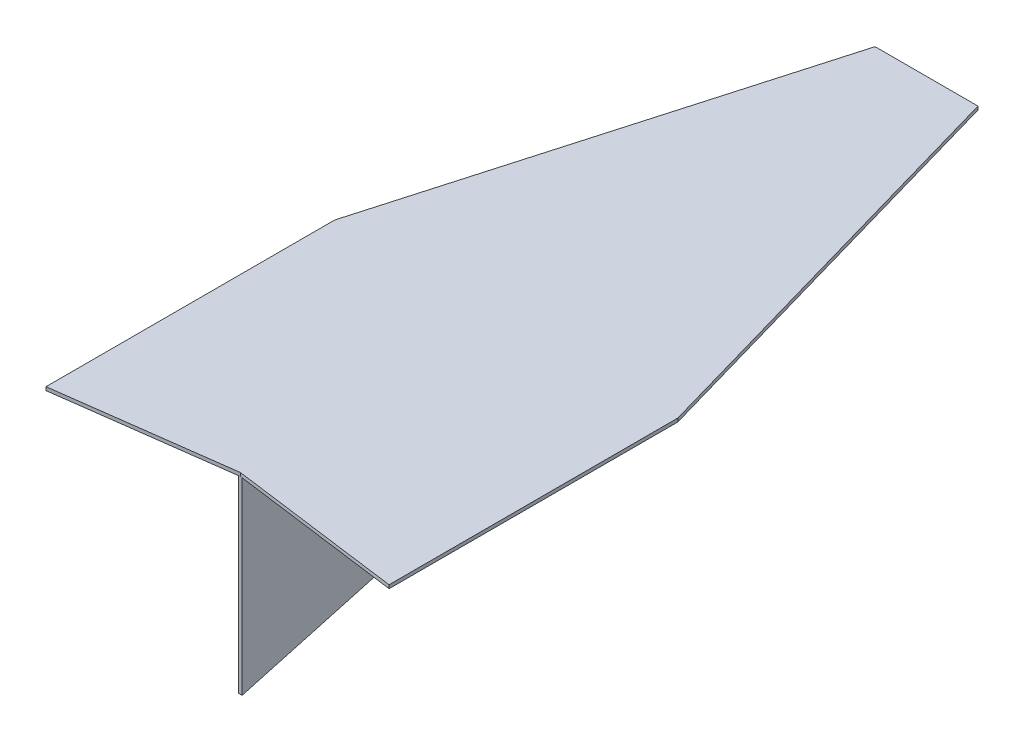
ISO-10303-21;
HEADER;
FILE_DESCRIPTION(('STEP AP214'),'2;1');
FILE_NAME('part.step','',(''),(''),'','','');
FILE_SCHEMA(('AUTOMOTIVE_DESIGN { 1 0 10303 214 1 1 1 1 }'));
ENDSEC;
DATA;
#1=APPLICATION_CONTEXT('core data for automotive mechanical design processes');
#2=APPLICATION_PROTOCOL_DEFINITION('international standard','automotive_design',2000,#1);
#3=PRODUCT_CONTEXT('',#1,'mechanical');
#4=PRODUCT('Part','Part','',(#3));
#5=PRODUCT_RELATED_PRODUCT_CATEGORY('part','',(#4));
#6=PRODUCT_DEFINITION_FORMATION('','',#4);
#7=PRODUCT_DEFINITION_CONTEXT('part definition',#1,'design');
#8=PRODUCT_DEFINITION('design','',#6,#7);
#9=PRODUCT_DEFINITION_SHAPE('','',#8);
#10=(LENGTH_UNIT() NAMED_UNIT(*) SI_UNIT(.MILLI.,.METRE.));
#11=(NAMED_UNIT(*) PLANE_ANGLE_UNIT() SI_UNIT($,.RADIAN.));
#12=(NAMED_UNIT(*) SI_UNIT($,.STERADIAN.) SOLID_ANGLE_UNIT());
#13=UNCERTAINTY_MEASURE_WITH_UNIT(LENGTH_MEASURE(1.E-05),#10,'distance_accuracy_value','');
#14=(GEOMETRIC_REPRESENTATION_CONTEXT(3) GLOBAL_UNCERTAINTY_ASSIGNED_CONTEXT((#13)) GLOBAL_UNIT_ASSIGNED_CONTEXT((#10,
#11,#12)) REPRESENTATION_CONTEXT('',''));
#15=CARTESIAN_POINT('',(0.,0.,0.));
#16=DIRECTION('',(0.,0.,1.));
#17=DIRECTION('',(1.,0.,0.));
#18=AXIS2_PLACEMENT_3D('',#15,#16,#17);
#19=CARTESIAN_POINT('',(0.,0.,0.));
#20=DIRECTION('',(0.,-1.,0.));
#21=DIRECTION('',(0.,0.,-1.));
#22=AXIS2_PLACEMENT_3D('',#19,#20,#21);
#23=PLANE('',#22);
#24=DIRECTION('',(0.,0.,1.));
#25=VECTOR('',#24,1.);
#26=CARTESIAN_POINT('',(-0.5,0.,0.));
#27=LINE('',#26,#25);
#28=CARTESIAN_POINT('',(-0.5,0.,-105.));
#29=VERTEX_POINT('',#28);
#30=CARTESIAN_POINT('',(-0.5,0.,95.));
#31=VERTEX_POINT('',#30);
#32=EDGE_CURVE('E201',#29,#31,#27,.T.);
#33=ORIENTED_EDGE('',*,*,#32,.T.);
#34=DIRECTION('',(1.,0.,0.));
#35=VECTOR('',#34,1.);
#36=CARTESIAN_POINT('',(-0.5,0.,95.));
#37=LINE('',#36,#35);
#38=CARTESIAN_POINT('',(1.50920942409982E-13,0.,95.));
#39=VERTEX_POINT('',#38);
#40=EDGE_CURVE('E50',#31,#39,#37,.T.);
#41=ORIENTED_EDGE('',*,*,#40,.T.);
#42=DIRECTION('',(0.991227900682635,0.,-0.132163720091018));
#43=VECTOR('',#42,1.);
#44=CARTESIAN_POINT('',(12.4454148471616,0.,93.3406113537118));
#45=LINE('',#44,#43);
#46=CARTESIAN_POINT('',(-50.,0.,101.666666666667));
#47=VERTEX_POINT('',#46);
#48=EDGE_CURVE('E193',#47,#39,#45,.T.);
#49=ORIENTED_EDGE('',*,*,#48,.F.);
#50=DIRECTION('',(0.,0.,1.));
#51=VECTOR('',#50,1.);
#52=CARTESIAN_POINT('',(-50.,0.,105.));
#53=LINE('',#52,#51);
#54=CARTESIAN_POINT('',(-50.,0.,17.5));
#55=VERTEX_POINT('',#54);
#56=EDGE_CURVE('E43',#55,#47,#53,.T.);
#57=ORIENTED_EDGE('',*,*,#56,.F.);
#58=DIRECTION('',(0.274721127897378,0.,-0.961523947640823));
#59=VECTOR('',#58,1.);
#60=CARTESIAN_POINT('',(-41.6037735849057,0.,-11.8867924528302));
#61=LINE('',#60,#59);
#62=CARTESIAN_POINT('',(-15.,0.,-105.));
#63=VERTEX_POINT('',#62);
#64=EDGE_CURVE('E177',#55,#63,#61,.T.);
#65=ORIENTED_EDGE('',*,*,#64,.T.);
#66=DIRECTION('',(-1.,0.,0.));
#67=VECTOR('',#66,1.);
#68=CARTESIAN_POINT('',(-50.,0.,-105.));
#69=LINE('',#68,#67);
#70=EDGE_CURVE('E64',#29,#63,#69,.T.);
#71=ORIENTED_EDGE('',*,*,#70,.F.);
#72=EDGE_LOOP('',(#33,#41,#49,#57,#65,#71));
#73=FACE_BOUND('',#72,.T.);
#74=ADVANCED_FACE('F39',(#73),#23,.T.);
#75=CARTESIAN_POINT('',(50.,1.,105.));
#76=DIRECTION('',(-1.,0.,0.));
#77=DIRECTION('',(0.,0.,1.));
#78=AXIS2_PLACEMENT_3D('',#75,#76,#77);
#79=PLANE('',#78);
#80=DIRECTION('',(0.,0.,-1.));
#81=VECTOR('',#80,1.);
#82=CARTESIAN_POINT('',(50.,1.,105.));
#83=LINE('',#82,#81);
#84=CARTESIAN_POINT('',(50.,1.,101.666666666667));
#85=VERTEX_POINT('',#84);
#86=CARTESIAN_POINT('',(50.,1.,17.5));
#87=VERTEX_POINT('',#86);
#88=EDGE_CURVE('E150',#85,#87,#83,.T.);
#89=ORIENTED_EDGE('',*,*,#88,.F.);
#90=DIRECTION('',(0.,1.,0.));
#91=VECTOR('',#90,1.);
#92=CARTESIAN_POINT('',(50.,0.,101.666666666667));
#93=LINE('',#92,#91);
#94=CARTESIAN_POINT('',(50.,0.,101.666666666667));
#95=VERTEX_POINT('',#94);
#96=EDGE_CURVE('E186',#95,#85,#93,.T.);
#97=ORIENTED_EDGE('',*,*,#96,.F.);
#98=DIRECTION('',(0.,0.,-1.));
#99=VECTOR('',#98,1.);
#100=CARTESIAN_POINT('',(50.,0.,105.));
#101=LINE('',#100,#99);
#102=CARTESIAN_POINT('',(50.,0.,17.5));
#103=VERTEX_POINT('',#102);
#104=EDGE_CURVE('E151',#95,#103,#101,.T.);
#105=ORIENTED_EDGE('',*,*,#104,.T.);
#106=DIRECTION('',(0.,1.,0.));
#107=VECTOR('',#106,1.);
#108=CARTESIAN_POINT('',(50.,0.,17.5));
#109=LINE('',#108,#107);
#110=EDGE_CURVE('E163',#103,#87,#109,.T.);
#111=ORIENTED_EDGE('',*,*,#110,.T.);
#112=EDGE_LOOP('',(#89,#97,#105,#111));
#113=FACE_BOUND('',#112,.T.);
#114=ADVANCED_FACE('F41',(#113),#79,.F.);
#115=CARTESIAN_POINT('',(-50.,1.,-105.));
#116=DIRECTION('',(0.,0.,1.));
#117=DIRECTION('',(1.,0.,0.));
#118=AXIS2_PLACEMENT_3D('',#115,#116,#117);
#119=PLANE('',#118);
#120=CARTESIAN_POINT('',(15.,0.,-105.));
#121=VERTEX_POINT('',#120);
#122=CARTESIAN_POINT('',(0.5,0.,-105.));
#123=VERTEX_POINT('',#122);
#124=EDGE_CURVE('E142',#121,#123,#69,.T.);
#125=ORIENTED_EDGE('',*,*,#124,.T.);
#126=DIRECTION('',(1.,0.,0.));
#127=VECTOR('',#126,1.);
#128=CARTESIAN_POINT('',(-0.5,0.,-105.));
#129=LINE('',#128,#127);
#130=EDGE_CURVE('E119',#29,#123,#129,.T.);
#131=ORIENTED_EDGE('',*,*,#130,.F.);
#132=ORIENTED_EDGE('',*,*,#70,.T.);
#133=DIRECTION('',(0.,1.,0.));
#134=VECTOR('',#133,1.);
#135=CARTESIAN_POINT('',(-15.,0.,-105.));
#136=LINE('',#135,#134);
#137=CARTESIAN_POINT('',(-15.,1.,-105.));
#138=VERTEX_POINT('',#137);
#139=EDGE_CURVE('E176',#63,#138,#136,.T.);
#140=ORIENTED_EDGE('',*,*,#139,.T.);
#141=DIRECTION('',(-1.,0.,0.));
#142=VECTOR('',#141,1.);
#143=CARTESIAN_POINT('',(-50.,1.,-105.));
#144=LINE('',#143,#142);
#145=CARTESIAN_POINT('',(15.,1.,-105.));
#146=VERTEX_POINT('',#145);
#147=EDGE_CURVE('E158',#146,#138,#144,.T.);
#148=ORIENTED_EDGE('',*,*,#147,.F.);
#149=DIRECTION('',(0.,1.,0.));
#150=VECTOR('',#149,1.);
#151=CARTESIAN_POINT('',(15.,0.,-105.));
#152=LINE('',#151,#150);
#153=EDGE_CURVE('E148',#121,#146,#152,.T.);
#154=ORIENTED_EDGE('',*,*,#153,.F.);
#155=EDGE_LOOP('',(#125,#131,#132,#140,#148,#154));
#156=FACE_BOUND('',#155,.T.);
#157=ADVANCED_FACE('F146',(#156),#119,.F.);
#158=CARTESIAN_POINT('',(-50.,1.,105.));
#159=DIRECTION('',(1.,0.,0.));
#160=DIRECTION('',(0.,0.,-1.));
#161=AXIS2_PLACEMENT_3D('',#158,#159,#160);
#162=PLANE('',#161);
#163=DIRECTION('',(0.,1.,0.));
#164=VECTOR('',#163,1.);
#165=CARTESIAN_POINT('',(-50.,0.,101.666666666667));
#166=LINE('',#165,#164);
#167=CARTESIAN_POINT('',(-50.,1.,101.666666666667));
#168=VERTEX_POINT('',#167);
#169=EDGE_CURVE('E183',#47,#168,#166,.T.);
#170=ORIENTED_EDGE('',*,*,#169,.T.);
#171=DIRECTION('',(0.,0.,1.));
#172=VECTOR('',#171,1.);
#173=CARTESIAN_POINT('',(-50.,1.,105.));
#174=LINE('',#173,#172);
#175=CARTESIAN_POINT('',(-50.,1.,17.5));
#176=VERTEX_POINT('',#175);
#177=EDGE_CURVE('E48',#176,#168,#174,.T.);
#178=ORIENTED_EDGE('',*,*,#177,.F.);
#179=DIRECTION('',(0.,1.,0.));
#180=VECTOR('',#179,1.);
#181=CARTESIAN_POINT('',(-50.,0.,17.5));
#182=LINE('',#181,#180);
#183=EDGE_CURVE('E174',#55,#176,#182,.T.);
#184=ORIENTED_EDGE('',*,*,#183,.F.);
#185=ORIENTED_EDGE('',*,*,#56,.T.);
#186=EDGE_LOOP('',(#170,#178,#184,#185));
#187=FACE_BOUND('',#186,.T.);
#188=ADVANCED_FACE('F217',(#187),#162,.F.);
#189=CARTESIAN_POINT('',(0.,1.,0.));
#190=DIRECTION('',(0.,-1.,0.));
#191=DIRECTION('',(0.,0.,-1.));
#192=AXIS2_PLACEMENT_3D('',#189,#190,#191);
#193=PLANE('',#192);
#194=DIRECTION('',(0.991227900682635,0.,-0.132163720091018));
#195=VECTOR('',#194,1.);
#196=CARTESIAN_POINT('',(12.4454148471616,1.,93.3406113537118));
#197=LINE('',#196,#195);
#198=CARTESIAN_POINT('',(0.,1.,95.));
#199=VERTEX_POINT('',#198);
#200=EDGE_CURVE('E179',#168,#199,#197,.T.);
#201=ORIENTED_EDGE('',*,*,#200,.T.);
#202=DIRECTION('',(-0.991227900682635,0.,-0.132163720091018));
#203=VECTOR('',#202,1.);
#204=CARTESIAN_POINT('',(-12.4454148471615,1.,93.3406113537118));
#205=LINE('',#204,#203);
#206=EDGE_CURVE('E190',#85,#199,#205,.T.);
#207=ORIENTED_EDGE('',*,*,#206,.F.);
#208=ORIENTED_EDGE('',*,*,#88,.T.);
#209=DIRECTION('',(-0.274721127897378,0.,-0.961523947640823));
#210=VECTOR('',#209,1.);
#211=CARTESIAN_POINT('',(41.6037735849057,1.,-11.8867924528302));
#212=LINE('',#211,#210);
#213=EDGE_CURVE('E169',#87,#146,#212,.T.);
#214=ORIENTED_EDGE('',*,*,#213,.T.);
#215=ORIENTED_EDGE('',*,*,#147,.T.);
#216=DIRECTION('',(0.274721127897378,0.,-0.961523947640823));
#217=VECTOR('',#216,1.);
#218=CARTESIAN_POINT('',(-41.6037735849057,1.,-11.8867924528302));
#219=LINE('',#218,#217);
#220=EDGE_CURVE('E168',#176,#138,#219,.T.);
#221=ORIENTED_EDGE('',*,*,#220,.F.);
#222=ORIENTED_EDGE('',*,*,#177,.T.);
#223=EDGE_LOOP('',(#201,#207,#208,#214,#215,#221,#222));
#224=FACE_BOUND('',#223,.T.);
#225=ADVANCED_FACE('F219',(#224),#193,.F.);
#226=DIRECTION('',(0.,0.,1.));
#227=VECTOR('',#226,1.);
#228=CARTESIAN_POINT('',(0.5,0.,0.));
#229=LINE('',#228,#227);
#230=CARTESIAN_POINT('',(0.5,0.,95.));
#231=VERTEX_POINT('',#230);
#232=EDGE_CURVE('E134',#123,#231,#229,.T.);
#233=ORIENTED_EDGE('',*,*,#232,.F.);
#234=ORIENTED_EDGE('',*,*,#124,.F.);
#235=DIRECTION('',(-0.274721127897378,0.,-0.961523947640823));
#236=VECTOR('',#235,1.);
#237=CARTESIAN_POINT('',(41.6037735849057,0.,-11.8867924528302));
#238=LINE('',#237,#236);
#239=EDGE_CURVE('E166',#103,#121,#238,.T.);
#240=ORIENTED_EDGE('',*,*,#239,.F.);
#241=ORIENTED_EDGE('',*,*,#104,.F.);
#242=DIRECTION('',(-0.991227900682635,0.,-0.132163720091018));
#243=VECTOR('',#242,1.);
#244=CARTESIAN_POINT('',(-12.4454148471615,0.,93.3406113537118));
#245=LINE('',#244,#243);
#246=EDGE_CURVE('E187',#95,#39,#245,.T.);
#247=ORIENTED_EDGE('',*,*,#246,.T.);
#248=EDGE_CURVE('E11',#39,#231,#37,.T.);
#249=ORIENTED_EDGE('',*,*,#248,.T.);
#250=EDGE_LOOP('',(#233,#234,#240,#241,#247,#249));
#251=FACE_BOUND('',#250,.T.);
#252=ADVANCED_FACE('F140',(#251),#23,.T.);
#253=CARTESIAN_POINT('',(41.6037735849057,0.,-11.8867924528302));
#254=DIRECTION('',(0.961523947640823,0.,-0.274721127897378));
#255=DIRECTION('',(-0.274721127897378,0.,-0.961523947640823));
#256=AXIS2_PLACEMENT_3D('',#253,#254,#255);
#257=PLANE('',#256);
#258=ORIENTED_EDGE('',*,*,#213,.F.);
#259=ORIENTED_EDGE('',*,*,#110,.F.);
#260=ORIENTED_EDGE('',*,*,#239,.T.);
#261=ORIENTED_EDGE('',*,*,#153,.T.);
#262=EDGE_LOOP('',(#258,#259,#260,#261));
#263=FACE_BOUND('',#262,.T.);
#264=ADVANCED_FACE('F223',(#263),#257,.T.);
#265=CARTESIAN_POINT('',(-41.6037735849057,0.,-11.8867924528302));
#266=DIRECTION('',(0.961523947640823,0.,0.274721127897378));
#267=DIRECTION('',(0.274721127897378,0.,-0.961523947640823));
#268=AXIS2_PLACEMENT_3D('',#265,#266,#267);
#269=PLANE('',#268);
#270=ORIENTED_EDGE('',*,*,#220,.T.);
#271=ORIENTED_EDGE('',*,*,#139,.F.);
#272=ORIENTED_EDGE('',*,*,#64,.F.);
#273=ORIENTED_EDGE('',*,*,#183,.T.);
#274=EDGE_LOOP('',(#270,#271,#272,#273));
#275=FACE_BOUND('',#274,.T.);
#276=ADVANCED_FACE('F213',(#275),#269,.F.);
#277=CARTESIAN_POINT('',(12.4454148471616,0.,93.3406113537118));
#278=DIRECTION('',(0.132163720091018,0.,0.991227900682635));
#279=DIRECTION('',(0.991227900682635,0.,-0.132163720091018));
#280=AXIS2_PLACEMENT_3D('',#277,#278,#279);
#281=PLANE('',#280);
#282=ORIENTED_EDGE('',*,*,#200,.F.);
#283=ORIENTED_EDGE('',*,*,#169,.F.);
#284=ORIENTED_EDGE('',*,*,#48,.T.);
#285=DIRECTION('',(0.,1.,0.));
#286=VECTOR('',#285,1.);
#287=CARTESIAN_POINT('',(0.,0.,95.));
#288=LINE('',#287,#286);
#289=EDGE_CURVE('E155',#39,#199,#288,.T.);
#290=ORIENTED_EDGE('',*,*,#289,.T.);
#291=EDGE_LOOP('',(#282,#283,#284,#290));
#292=FACE_BOUND('',#291,.T.);
#293=ADVANCED_FACE('F231',(#292),#281,.T.);
#294=CARTESIAN_POINT('',(-12.4454148471615,0.,93.3406113537118));
#295=DIRECTION('',(0.132163720091018,0.,-0.991227900682635));
#296=DIRECTION('',(-0.991227900682635,0.,-0.132163720091018));
#297=AXIS2_PLACEMENT_3D('',#294,#295,#296);
#298=PLANE('',#297);
#299=ORIENTED_EDGE('',*,*,#206,.T.);
#300=ORIENTED_EDGE('',*,*,#289,.F.);
#301=ORIENTED_EDGE('',*,*,#246,.F.);
#302=ORIENTED_EDGE('',*,*,#96,.T.);
#303=EDGE_LOOP('',(#299,#300,#301,#302));
#304=FACE_BOUND('',#303,.T.);
#305=ADVANCED_FACE('F229',(#304),#298,.F.);
#306=CARTESIAN_POINT('',(-0.5,-26.8448576409065,-7.38233585124927));
#307=DIRECTION('',(0.,0.96420539280379,0.265156483021042));
#308=DIRECTION('',(0.,-0.265156483021042,0.96420539280379));
#309=AXIS2_PLACEMENT_3D('',#306,#307,#308);
#310=PLANE('',#309);
#311=ORIENTED_EDGE('',*,*,#130,.T.);
#312=DIRECTION('',(0.,-0.265156483021042,0.96420539280379));
#313=VECTOR('',#312,1.);
#314=CARTESIAN_POINT('',(0.5,-26.8448576409065,-7.38233585124927));
#315=LINE('',#314,#313);
#316=CARTESIAN_POINT('',(0.5,-55.,95.));
#317=VERTEX_POINT('',#316);
#318=EDGE_CURVE('E123',#123,#317,#315,.T.);
#319=ORIENTED_EDGE('',*,*,#318,.T.);
#320=DIRECTION('',(1.,0.,0.));
#321=VECTOR('',#320,1.);
#322=CARTESIAN_POINT('',(-0.5,-55.,95.));
#323=LINE('',#322,#321);
#324=CARTESIAN_POINT('',(-0.5,-55.,95.));
#325=VERTEX_POINT('',#324);
#326=EDGE_CURVE('E172',#325,#317,#323,.T.);
#327=ORIENTED_EDGE('',*,*,#326,.F.);
#328=DIRECTION('',(0.,-0.265156483021042,0.96420539280379));
#329=VECTOR('',#328,1.);
#330=CARTESIAN_POINT('',(-0.5,-26.8448576409065,-7.38233585124927));
#331=LINE('',#330,#329);
#332=EDGE_CURVE('E126',#29,#325,#331,.T.);
#333=ORIENTED_EDGE('',*,*,#332,.F.);
#334=EDGE_LOOP('',(#311,#319,#327,#333));
#335=FACE_BOUND('',#334,.T.);
#336=ADVANCED_FACE('F121',(#335),#310,.F.);
#337=CARTESIAN_POINT('',(-0.5,0.,95.));
#338=DIRECTION('',(0.,0.,-1.));
#339=DIRECTION('',(-1.,0.,0.));
#340=AXIS2_PLACEMENT_3D('',#337,#338,#339);
#341=PLANE('',#340);
#342=ORIENTED_EDGE('',*,*,#326,.T.);
#343=DIRECTION('',(0.,1.,0.));
#344=VECTOR('',#343,1.);
#345=CARTESIAN_POINT('',(0.5,0.,95.));
#346=LINE('',#345,#344);
#347=EDGE_CURVE('E136',#317,#231,#346,.T.);
#348=ORIENTED_EDGE('',*,*,#347,.T.);
#349=ORIENTED_EDGE('',*,*,#248,.F.);
#350=ORIENTED_EDGE('',*,*,#40,.F.);
#351=DIRECTION('',(0.,1.,0.));
#352=VECTOR('',#351,1.);
#353=CARTESIAN_POINT('',(-0.5,0.,95.));
#354=LINE('',#353,#352);
#355=EDGE_CURVE('E129',#325,#31,#354,.T.);
#356=ORIENTED_EDGE('',*,*,#355,.F.);
#357=EDGE_LOOP('',(#342,#348,#349,#350,#356));
#358=FACE_BOUND('',#357,.T.);
#359=ADVANCED_FACE('F205',(#358),#341,.F.);
#360=CARTESIAN_POINT('',(-0.5,0.,0.));
#361=DIRECTION('',(1.,0.,0.));
#362=DIRECTION('',(0.,0.,-1.));
#363=AXIS2_PLACEMENT_3D('',#360,#361,#362);
#364=PLANE('',#363);
#365=ORIENTED_EDGE('',*,*,#332,.T.);
#366=ORIENTED_EDGE('',*,*,#355,.T.);
#367=ORIENTED_EDGE('',*,*,#32,.F.);
#368=EDGE_LOOP('',(#365,#366,#367));
#369=FACE_BOUND('',#368,.T.);
#370=ADVANCED_FACE('F207',(#369),#364,.F.);
#371=CARTESIAN_POINT('',(0.5,0.,0.));
#372=DIRECTION('',(1.,0.,0.));
#373=DIRECTION('',(0.,0.,-1.));
#374=AXIS2_PLACEMENT_3D('',#371,#372,#373);
#375=PLANE('',#374);
#376=ORIENTED_EDGE('',*,*,#318,.F.);
#377=ORIENTED_EDGE('',*,*,#232,.T.);
#378=ORIENTED_EDGE('',*,*,#347,.F.);
#379=EDGE_LOOP('',(#376,#377,#378));
#380=FACE_BOUND('',#379,.T.);
#381=ADVANCED_FACE('F133',(#380),#375,.T.);
#382=CLOSED_SHELL('',(#74,#114,#157,#188,#225,#252,#264,#276,#293,#305,#336,#359,#370,#381));
#383=MANIFOLD_SOLID_BREP('B2',#382);
#384=ADVANCED_BREP_SHAPE_REPRESENTATION('',(#18,#383),#14);
#385=SHAPE_DEFINITION_REPRESENTATION(#9,#384);
ENDSEC;
END-ISO-10303-21;
